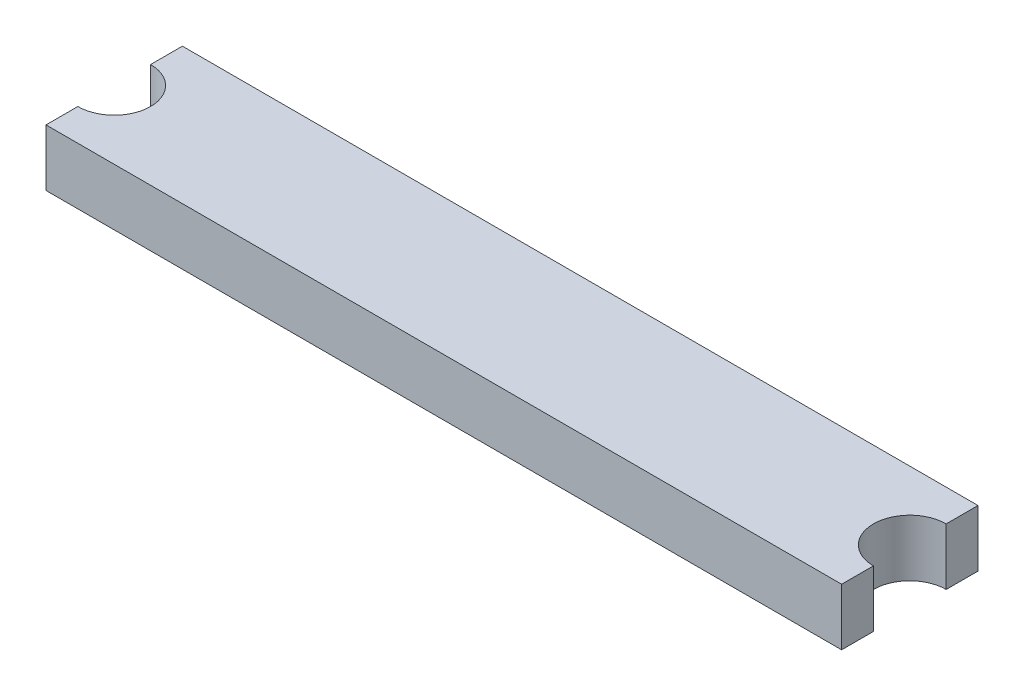
ISO-10303-21;
HEADER;
FILE_DESCRIPTION(('STEP AP214'),'2;1');
FILE_NAME('part.step','',(''),(''),'','','');
FILE_SCHEMA(('AUTOMOTIVE_DESIGN { 1 0 10303 214 1 1 1 1 }'));
ENDSEC;
DATA;
#1=APPLICATION_CONTEXT('core data for automotive mechanical design processes');
#2=APPLICATION_PROTOCOL_DEFINITION('international standard','automotive_design',2000,#1);
#3=PRODUCT_CONTEXT('',#1,'mechanical');
#4=PRODUCT('Part','Part','',(#3));
#5=PRODUCT_RELATED_PRODUCT_CATEGORY('part','',(#4));
#6=PRODUCT_DEFINITION_FORMATION('','',#4);
#7=PRODUCT_DEFINITION_CONTEXT('part definition',#1,'design');
#8=PRODUCT_DEFINITION('design','',#6,#7);
#9=PRODUCT_DEFINITION_SHAPE('','',#8);
#10=(LENGTH_UNIT() NAMED_UNIT(*) SI_UNIT(.MILLI.,.METRE.));
#11=(NAMED_UNIT(*) PLANE_ANGLE_UNIT() SI_UNIT($,.RADIAN.));
#12=(NAMED_UNIT(*) SI_UNIT($,.STERADIAN.) SOLID_ANGLE_UNIT());
#13=UNCERTAINTY_MEASURE_WITH_UNIT(LENGTH_MEASURE(1.E-05),#10,'distance_accuracy_value','');
#14=(GEOMETRIC_REPRESENTATION_CONTEXT(3) GLOBAL_UNCERTAINTY_ASSIGNED_CONTEXT((#13)) GLOBAL_UNIT_ASSIGNED_CONTEXT((#10,
#11,#12)) REPRESENTATION_CONTEXT('',''));
#15=CARTESIAN_POINT('',(0.,0.,0.));
#16=DIRECTION('',(0.,0.,1.));
#17=DIRECTION('',(1.,0.,0.));
#18=AXIS2_PLACEMENT_3D('',#15,#16,#17);
#19=CARTESIAN_POINT('',(175.,25.,-30.));
#20=DIRECTION('',(-1.,0.,0.));
#21=DIRECTION('',(0.,0.,1.));
#22=AXIS2_PLACEMENT_3D('',#19,#20,#21);
#23=PLANE('',#22);
#24=DIRECTION('',(0.,0.,-1.));
#25=VECTOR('',#24,1.);
#26=CARTESIAN_POINT('',(175.,0.,-30.));
#27=LINE('',#26,#25);
#28=CARTESIAN_POINT('',(175.,0.,30.));
#29=VERTEX_POINT('',#28);
#30=CARTESIAN_POINT('',(175.,0.,16.));
#31=VERTEX_POINT('',#30);
#32=EDGE_CURVE('E124',#29,#31,#27,.T.);
#33=ORIENTED_EDGE('',*,*,#32,.T.);
#34=DIRECTION('',(0.,1.,0.));
#35=VECTOR('',#34,1.);
#36=CARTESIAN_POINT('',(175.,0.,16.));
#37=LINE('',#36,#35);
#38=CARTESIAN_POINT('',(175.,25.,16.));
#39=VERTEX_POINT('',#38);
#40=EDGE_CURVE('E58',#31,#39,#37,.T.);
#41=ORIENTED_EDGE('',*,*,#40,.T.);
#42=DIRECTION('',(0.,0.,-1.));
#43=VECTOR('',#42,1.);
#44=CARTESIAN_POINT('',(175.,25.,-30.));
#45=LINE('',#44,#43);
#46=CARTESIAN_POINT('',(175.,25.,30.));
#47=VERTEX_POINT('',#46);
#48=EDGE_CURVE('E170',#47,#39,#45,.T.);
#49=ORIENTED_EDGE('',*,*,#48,.F.);
#50=DIRECTION('',(0.,-1.,0.));
#51=VECTOR('',#50,1.);
#52=CARTESIAN_POINT('',(175.,25.,30.));
#53=LINE('',#52,#51);
#54=EDGE_CURVE('E130',#47,#29,#53,.T.);
#55=ORIENTED_EDGE('',*,*,#54,.T.);
#56=EDGE_LOOP('',(#33,#41,#49,#55));
#57=FACE_BOUND('',#56,.T.);
#58=ADVANCED_FACE('F35',(#57),#23,.F.);
#59=CARTESIAN_POINT('',(-175.,25.,-30.));
#60=DIRECTION('',(1.,0.,0.));
#61=DIRECTION('',(0.,0.,-1.));
#62=AXIS2_PLACEMENT_3D('',#59,#60,#61);
#63=PLANE('',#62);
#64=DIRECTION('',(0.,0.,1.));
#65=VECTOR('',#64,1.);
#66=CARTESIAN_POINT('',(-175.,0.,-30.));
#67=LINE('',#66,#65);
#68=CARTESIAN_POINT('',(-175.,0.,-30.));
#69=VERTEX_POINT('',#68);
#70=CARTESIAN_POINT('',(-175.,0.,-16.));
#71=VERTEX_POINT('',#70);
#72=EDGE_CURVE('E121',#69,#71,#67,.T.);
#73=ORIENTED_EDGE('',*,*,#72,.T.);
#74=DIRECTION('',(0.,1.,0.));
#75=VECTOR('',#74,1.);
#76=CARTESIAN_POINT('',(-175.,0.,-16.));
#77=LINE('',#76,#75);
#78=CARTESIAN_POINT('',(-175.,25.,-16.));
#79=VERTEX_POINT('',#78);
#80=EDGE_CURVE('E50',#71,#79,#77,.T.);
#81=ORIENTED_EDGE('',*,*,#80,.T.);
#82=DIRECTION('',(0.,0.,1.));
#83=VECTOR('',#82,1.);
#84=CARTESIAN_POINT('',(-175.,25.,-30.));
#85=LINE('',#84,#83);
#86=CARTESIAN_POINT('',(-175.,25.,-30.));
#87=VERTEX_POINT('',#86);
#88=EDGE_CURVE('E155',#87,#79,#85,.T.);
#89=ORIENTED_EDGE('',*,*,#88,.F.);
#90=DIRECTION('',(0.,-1.,0.));
#91=VECTOR('',#90,1.);
#92=CARTESIAN_POINT('',(-175.,25.,-30.));
#93=LINE('',#92,#91);
#94=EDGE_CURVE('E136',#87,#69,#93,.T.);
#95=ORIENTED_EDGE('',*,*,#94,.T.);
#96=EDGE_LOOP('',(#73,#81,#89,#95));
#97=FACE_BOUND('',#96,.T.);
#98=ADVANCED_FACE('F152',(#97),#63,.F.);
#99=CARTESIAN_POINT('',(175.,25.,-16.));
#100=VERTEX_POINT('',#99);
#101=CARTESIAN_POINT('',(175.,25.,-30.));
#102=VERTEX_POINT('',#101);
#103=EDGE_CURVE('E129',#100,#102,#45,.T.);
#104=ORIENTED_EDGE('',*,*,#103,.F.);
#105=DIRECTION('',(0.,1.,0.));
#106=VECTOR('',#105,1.);
#107=CARTESIAN_POINT('',(175.,0.,-16.));
#108=LINE('',#107,#106);
#109=CARTESIAN_POINT('',(175.,0.,-16.));
#110=VERTEX_POINT('',#109);
#111=EDGE_CURVE('E150',#100,#110,#108,.F.);
#112=ORIENTED_EDGE('',*,*,#111,.T.);
#113=CARTESIAN_POINT('',(175.,0.,-30.));
#114=VERTEX_POINT('',#113);
#115=EDGE_CURVE('E149',#110,#114,#27,.T.);
#116=ORIENTED_EDGE('',*,*,#115,.T.);
#117=DIRECTION('',(0.,-1.,0.));
#118=VECTOR('',#117,1.);
#119=CARTESIAN_POINT('',(175.,25.,-30.));
#120=LINE('',#119,#118);
#121=EDGE_CURVE('E43',#102,#114,#120,.T.);
#122=ORIENTED_EDGE('',*,*,#121,.F.);
#123=EDGE_LOOP('',(#104,#112,#116,#122));
#124=FACE_BOUND('',#123,.T.);
#125=ADVANCED_FACE('F37',(#124),#23,.F.);
#126=CARTESIAN_POINT('',(-175.,25.,-30.));
#127=DIRECTION('',(0.,0.,1.));
#128=DIRECTION('',(1.,0.,0.));
#129=AXIS2_PLACEMENT_3D('',#126,#127,#128);
#130=PLANE('',#129);
#131=DIRECTION('',(-1.,0.,0.));
#132=VECTOR('',#131,1.);
#133=CARTESIAN_POINT('',(-175.,0.,-30.));
#134=LINE('',#133,#132);
#135=EDGE_CURVE('E122',#114,#69,#134,.T.);
#136=ORIENTED_EDGE('',*,*,#135,.T.);
#137=ORIENTED_EDGE('',*,*,#94,.F.);
#138=DIRECTION('',(-1.,0.,0.));
#139=VECTOR('',#138,1.);
#140=CARTESIAN_POINT('',(-175.,25.,-30.));
#141=LINE('',#140,#139);
#142=EDGE_CURVE('E145',#102,#87,#141,.T.);
#143=ORIENTED_EDGE('',*,*,#142,.F.);
#144=ORIENTED_EDGE('',*,*,#121,.T.);
#145=EDGE_LOOP('',(#136,#137,#143,#144));
#146=FACE_BOUND('',#145,.T.);
#147=ADVANCED_FACE('F142',(#146),#130,.F.);
#148=CARTESIAN_POINT('',(-175.,25.,16.));
#149=VERTEX_POINT('',#148);
#150=CARTESIAN_POINT('',(-175.,25.,30.));
#151=VERTEX_POINT('',#150);
#152=EDGE_CURVE('E113',#149,#151,#85,.T.);
#153=ORIENTED_EDGE('',*,*,#152,.F.);
#154=DIRECTION('',(0.,1.,0.));
#155=VECTOR('',#154,1.);
#156=CARTESIAN_POINT('',(-175.,0.,16.));
#157=LINE('',#156,#155);
#158=CARTESIAN_POINT('',(-175.,0.,16.));
#159=VERTEX_POINT('',#158);
#160=EDGE_CURVE('E99',#149,#159,#157,.F.);
#161=ORIENTED_EDGE('',*,*,#160,.T.);
#162=CARTESIAN_POINT('',(-175.,0.,30.));
#163=VERTEX_POINT('',#162);
#164=EDGE_CURVE('E111',#159,#163,#67,.T.);
#165=ORIENTED_EDGE('',*,*,#164,.T.);
#166=DIRECTION('',(0.,-1.,0.));
#167=VECTOR('',#166,1.);
#168=CARTESIAN_POINT('',(-175.,25.,30.));
#169=LINE('',#168,#167);
#170=EDGE_CURVE('E133',#151,#163,#169,.T.);
#171=ORIENTED_EDGE('',*,*,#170,.F.);
#172=EDGE_LOOP('',(#153,#161,#165,#171));
#173=FACE_BOUND('',#172,.T.);
#174=ADVANCED_FACE('F109',(#173),#63,.F.);
#175=CARTESIAN_POINT('',(-175.,25.,30.));
#176=DIRECTION('',(0.,0.,-1.));
#177=DIRECTION('',(-1.,0.,0.));
#178=AXIS2_PLACEMENT_3D('',#175,#176,#177);
#179=PLANE('',#178);
#180=DIRECTION('',(1.,0.,0.));
#181=VECTOR('',#180,1.);
#182=CARTESIAN_POINT('',(-175.,0.,30.));
#183=LINE('',#182,#181);
#184=EDGE_CURVE('E120',#163,#29,#183,.T.);
#185=ORIENTED_EDGE('',*,*,#184,.T.);
#186=ORIENTED_EDGE('',*,*,#54,.F.);
#187=DIRECTION('',(1.,0.,0.));
#188=VECTOR('',#187,1.);
#189=CARTESIAN_POINT('',(-175.,25.,30.));
#190=LINE('',#189,#188);
#191=EDGE_CURVE('E134',#151,#47,#190,.T.);
#192=ORIENTED_EDGE('',*,*,#191,.F.);
#193=ORIENTED_EDGE('',*,*,#170,.T.);
#194=EDGE_LOOP('',(#185,#186,#192,#193));
#195=FACE_BOUND('',#194,.T.);
#196=ADVANCED_FACE('F177',(#195),#179,.F.);
#197=CARTESIAN_POINT('',(0.,25.,0.));
#198=DIRECTION('',(0.,1.,0.));
#199=DIRECTION('',(0.,0.,1.));
#200=AXIS2_PLACEMENT_3D('',#197,#198,#199);
#201=PLANE('',#200);
#202=CARTESIAN_POINT('',(175.,25.,0.));
#203=DIRECTION('',(0.,1.,0.));
#204=DIRECTION('',(0.,0.,1.));
#205=AXIS2_PLACEMENT_3D('',#202,#203,#204);
#206=CIRCLE('',#205,16.);
#207=EDGE_CURVE('E114',#100,#39,#206,.T.);
#208=ORIENTED_EDGE('',*,*,#207,.F.);
#209=ORIENTED_EDGE('',*,*,#103,.T.);
#210=ORIENTED_EDGE('',*,*,#142,.T.);
#211=ORIENTED_EDGE('',*,*,#88,.T.);
#212=CARTESIAN_POINT('',(-175.,25.,0.));
#213=DIRECTION('',(0.,1.,0.));
#214=DIRECTION('',(0.,0.,1.));
#215=AXIS2_PLACEMENT_3D('',#212,#213,#214);
#216=CIRCLE('',#215,16.);
#217=EDGE_CURVE('E105',#149,#79,#216,.T.);
#218=ORIENTED_EDGE('',*,*,#217,.F.);
#219=ORIENTED_EDGE('',*,*,#152,.T.);
#220=ORIENTED_EDGE('',*,*,#191,.T.);
#221=ORIENTED_EDGE('',*,*,#48,.T.);
#222=EDGE_LOOP('',(#208,#209,#210,#211,#218,#219,#220,#221));
#223=FACE_BOUND('',#222,.T.);
#224=ADVANCED_FACE('F169',(#223),#201,.T.);
#225=CARTESIAN_POINT('',(0.,0.,0.));
#226=DIRECTION('',(0.,1.,0.));
#227=DIRECTION('',(0.,0.,1.));
#228=AXIS2_PLACEMENT_3D('',#225,#226,#227);
#229=PLANE('',#228);
#230=ORIENTED_EDGE('',*,*,#115,.F.);
#231=CARTESIAN_POINT('',(175.,0.,0.));
#232=DIRECTION('',(0.,1.,0.));
#233=DIRECTION('',(0.,0.,1.));
#234=AXIS2_PLACEMENT_3D('',#231,#232,#233);
#235=CIRCLE('',#234,16.);
#236=EDGE_CURVE('E11',#110,#31,#235,.T.);
#237=ORIENTED_EDGE('',*,*,#236,.T.);
#238=ORIENTED_EDGE('',*,*,#32,.F.);
#239=ORIENTED_EDGE('',*,*,#184,.F.);
#240=ORIENTED_EDGE('',*,*,#164,.F.);
#241=CARTESIAN_POINT('',(-175.,0.,0.));
#242=DIRECTION('',(0.,1.,0.));
#243=DIRECTION('',(0.,0.,1.));
#244=AXIS2_PLACEMENT_3D('',#241,#242,#243);
#245=CIRCLE('',#244,16.);
#246=EDGE_CURVE('E96',#159,#71,#245,.T.);
#247=ORIENTED_EDGE('',*,*,#246,.T.);
#248=ORIENTED_EDGE('',*,*,#72,.F.);
#249=ORIENTED_EDGE('',*,*,#135,.F.);
#250=EDGE_LOOP('',(#230,#237,#238,#239,#240,#247,#248,#249));
#251=FACE_BOUND('',#250,.T.);
#252=ADVANCED_FACE('F118',(#251),#229,.F.);
#253=CARTESIAN_POINT('',(-175.,0.,0.));
#254=DIRECTION('',(0.,1.,0.));
#255=DIRECTION('',(0.,0.,1.));
#256=AXIS2_PLACEMENT_3D('',#253,#254,#255);
#257=CYLINDRICAL_SURFACE('',#256,16.);
#258=ORIENTED_EDGE('',*,*,#246,.F.);
#259=ORIENTED_EDGE('',*,*,#160,.F.);
#260=ORIENTED_EDGE('',*,*,#217,.T.);
#261=ORIENTED_EDGE('',*,*,#80,.F.);
#262=EDGE_LOOP('',(#258,#259,#260,#261));
#263=FACE_BOUND('',#262,.T.);
#264=ADVANCED_FACE('F98',(#263),#257,.F.);
#265=CARTESIAN_POINT('',(175.,0.,0.));
#266=DIRECTION('',(0.,1.,0.));
#267=DIRECTION('',(0.,0.,1.));
#268=AXIS2_PLACEMENT_3D('',#265,#266,#267);
#269=CYLINDRICAL_SURFACE('',#268,16.);
#270=ORIENTED_EDGE('',*,*,#236,.F.);
#271=ORIENTED_EDGE('',*,*,#111,.F.);
#272=ORIENTED_EDGE('',*,*,#207,.T.);
#273=ORIENTED_EDGE('',*,*,#40,.F.);
#274=EDGE_LOOP('',(#270,#271,#272,#273));
#275=FACE_BOUND('',#274,.T.);
#276=ADVANCED_FACE('F166',(#275),#269,.F.);
#277=CLOSED_SHELL('',(#58,#98,#125,#147,#174,#196,#224,#252,#264,#276));
#278=MANIFOLD_SOLID_BREP('B2',#277);
#279=ADVANCED_BREP_SHAPE_REPRESENTATION('',(#18,#278),#14);
#280=SHAPE_DEFINITION_REPRESENTATION(#9,#279);
ENDSEC;
END-ISO-10303-21;
